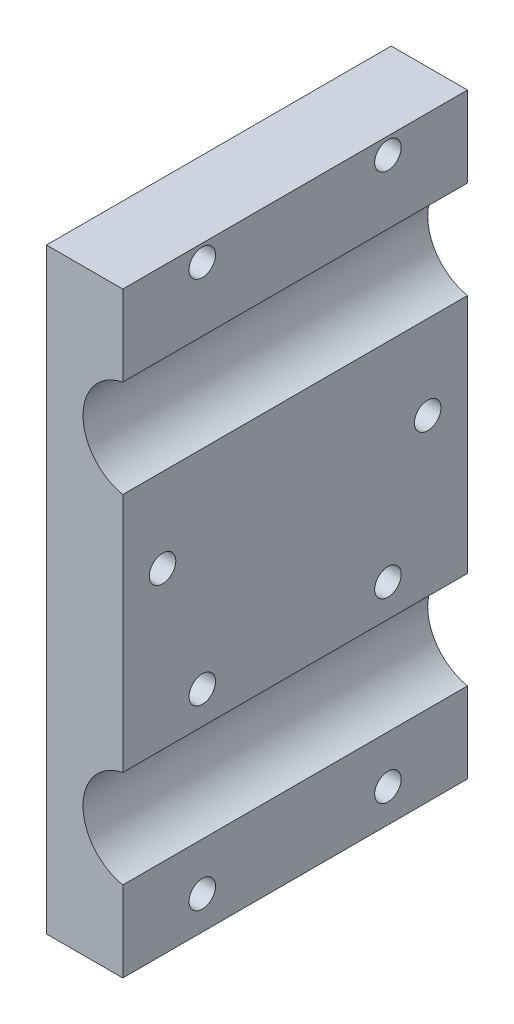
ISO-10303-21;
HEADER;
FILE_DESCRIPTION(('STEP AP214'),'2;1');
FILE_NAME('part.step','',(''),(''),'','','');
FILE_SCHEMA(('AUTOMOTIVE_DESIGN { 1 0 10303 214 1 1 1 1 }'));
ENDSEC;
DATA;
#1=APPLICATION_CONTEXT('core data for automotive mechanical design processes');
#2=APPLICATION_PROTOCOL_DEFINITION('international standard','automotive_design',2000,#1);
#3=PRODUCT_CONTEXT('',#1,'mechanical');
#4=PRODUCT('Part','Part','',(#3));
#5=PRODUCT_RELATED_PRODUCT_CATEGORY('part','',(#4));
#6=PRODUCT_DEFINITION_FORMATION('','',#4);
#7=PRODUCT_DEFINITION_CONTEXT('part definition',#1,'design');
#8=PRODUCT_DEFINITION('design','',#6,#7);
#9=PRODUCT_DEFINITION_SHAPE('','',#8);
#10=(LENGTH_UNIT() NAMED_UNIT(*) SI_UNIT(.MILLI.,.METRE.));
#11=(NAMED_UNIT(*) PLANE_ANGLE_UNIT() SI_UNIT($,.RADIAN.));
#12=(NAMED_UNIT(*) SI_UNIT($,.STERADIAN.) SOLID_ANGLE_UNIT());
#13=UNCERTAINTY_MEASURE_WITH_UNIT(LENGTH_MEASURE(1.E-05),#10,'distance_accuracy_value','');
#14=(GEOMETRIC_REPRESENTATION_CONTEXT(3) GLOBAL_UNCERTAINTY_ASSIGNED_CONTEXT((#13)) GLOBAL_UNIT_ASSIGNED_CONTEXT((#10,
#11,#12)) REPRESENTATION_CONTEXT('',''));
#15=CARTESIAN_POINT('',(0.,0.,0.));
#16=DIRECTION('',(0.,0.,1.));
#17=DIRECTION('',(1.,0.,0.));
#18=AXIS2_PLACEMENT_3D('',#15,#16,#17);
#19=CARTESIAN_POINT('',(-11.5000000000001,0.,52.));
#20=DIRECTION('',(1.,0.,0.));
#21=DIRECTION('',(0.,0.,-1.));
#22=AXIS2_PLACEMENT_3D('',#19,#20,#21);
#23=PLANE('',#22);
#24=CARTESIAN_POINT('',(-11.5000000000005,-39.5,6.));
#25=DIRECTION('',(1.,0.,0.));
#26=DIRECTION('',(0.,1.,0.));
#27=AXIS2_PLACEMENT_3D('',#24,#25,#26);
#28=CIRCLE('',#27,2.);
#29=CARTESIAN_POINT('',(-11.5000000000005,-37.5,6.));
#30=VERTEX_POINT('',#29);
#31=EDGE_CURVE('E210',#30,#30,#28,.T.);
#32=ORIENTED_EDGE('',*,*,#31,.T.);
#33=EDGE_LOOP('',(#32));
#34=FACE_BOUND('',#33,.T.);
#35=CARTESIAN_POINT('',(-11.5000000000005,-39.5,46.));
#36=DIRECTION('',(1.,0.,0.));
#37=DIRECTION('',(0.,1.,0.));
#38=AXIS2_PLACEMENT_3D('',#35,#36,#37);
#39=CIRCLE('',#38,2.);
#40=CARTESIAN_POINT('',(-11.5000000000005,-37.5,46.));
#41=VERTEX_POINT('',#40);
#42=EDGE_CURVE('E221',#41,#41,#39,.T.);
#43=ORIENTED_EDGE('',*,*,#42,.T.);
#44=EDGE_LOOP('',(#43));
#45=FACE_BOUND('',#44,.T.);
#46=CARTESIAN_POINT('',(-11.5000000000005,-58.2499999999999,12.));
#47=DIRECTION('',(1.,0.,0.));
#48=DIRECTION('',(0.,1.,0.));
#49=AXIS2_PLACEMENT_3D('',#46,#47,#48);
#50=CIRCLE('',#49,2.);
#51=CARTESIAN_POINT('',(-11.5000000000005,-56.2499999999999,12.));
#52=VERTEX_POINT('',#51);
#53=EDGE_CURVE('E187',#52,#52,#50,.T.);
#54=ORIENTED_EDGE('',*,*,#53,.T.);
#55=EDGE_LOOP('',(#54));
#56=FACE_BOUND('',#55,.T.);
#57=CARTESIAN_POINT('',(-11.5000000000005,-58.2499999999999,40.));
#58=DIRECTION('',(1.,0.,0.));
#59=DIRECTION('',(0.,1.,0.));
#60=AXIS2_PLACEMENT_3D('',#57,#58,#59);
#61=CIRCLE('',#60,2.);
#62=CARTESIAN_POINT('',(-11.5000000000005,-56.2499999999999,40.));
#63=VERTEX_POINT('',#62);
#64=EDGE_CURVE('E209',#63,#63,#61,.T.);
#65=ORIENTED_EDGE('',*,*,#64,.T.);
#66=EDGE_LOOP('',(#65));
#67=FACE_BOUND('',#66,.T.);
#68=CARTESIAN_POINT('',(-11.5000000000005,-85.,40.));
#69=DIRECTION('',(1.,0.,0.));
#70=DIRECTION('',(0.,1.,0.));
#71=AXIS2_PLACEMENT_3D('',#68,#69,#70);
#72=CIRCLE('',#71,2.);
#73=CARTESIAN_POINT('',(-11.5000000000005,-83.,40.));
#74=VERTEX_POINT('',#73);
#75=EDGE_CURVE('E186',#74,#74,#72,.T.);
#76=ORIENTED_EDGE('',*,*,#75,.T.);
#77=EDGE_LOOP('',(#76));
#78=FACE_BOUND('',#77,.T.);
#79=CARTESIAN_POINT('',(-11.5000000000005,-2.5,11.9999999999999));
#80=DIRECTION('',(1.,0.,0.));
#81=DIRECTION('',(0.,-1.,0.));
#82=AXIS2_PLACEMENT_3D('',#79,#80,#81);
#83=CIRCLE('',#82,2.);
#84=CARTESIAN_POINT('',(-11.5000000000005,-0.5,11.9999999999999));
#85=VERTEX_POINT('',#84);
#86=EDGE_CURVE('E195',#85,#85,#83,.T.);
#87=ORIENTED_EDGE('',*,*,#86,.T.);
#88=EDGE_LOOP('',(#87));
#89=FACE_BOUND('',#88,.T.);
#90=CARTESIAN_POINT('',(-11.5000000000001,-84.9999999999999,11.9999999999999));
#91=DIRECTION('',(1.,0.,0.));
#92=DIRECTION('',(0.,-1.,0.));
#93=AXIS2_PLACEMENT_3D('',#90,#91,#92);
#94=CIRCLE('',#93,2.);
#95=CARTESIAN_POINT('',(-11.5000000000001,-82.9999999999999,11.9999999999999));
#96=VERTEX_POINT('',#95);
#97=EDGE_CURVE('E177',#96,#96,#94,.T.);
#98=ORIENTED_EDGE('',*,*,#97,.T.);
#99=EDGE_LOOP('',(#98));
#100=FACE_BOUND('',#99,.T.);
#101=CARTESIAN_POINT('',(-11.5000000000001,-2.5,40.));
#102=DIRECTION('',(1.,0.,0.));
#103=DIRECTION('',(0.,1.,0.));
#104=AXIS2_PLACEMENT_3D('',#101,#102,#103);
#105=CIRCLE('',#104,2.);
#106=CARTESIAN_POINT('',(-11.5000000000001,-0.499999999999999,40.));
#107=VERTEX_POINT('',#106);
#108=EDGE_CURVE('E176',#107,#107,#105,.T.);
#109=ORIENTED_EDGE('',*,*,#108,.T.);
#110=EDGE_LOOP('',(#109));
#111=FACE_BOUND('',#110,.T.);
#112=DIRECTION('',(0.,-1.,0.));
#113=VECTOR('',#112,1.);
#114=CARTESIAN_POINT('',(-11.5,0.,0.));
#115=LINE('',#114,#113);
#116=CARTESIAN_POINT('',(-11.5,0.,0.));
#117=VERTEX_POINT('',#116);
#118=CARTESIAN_POINT('',(-11.5,-90.,0.));
#119=VERTEX_POINT('',#118);
#120=EDGE_CURVE('E181',#117,#119,#115,.T.);
#121=ORIENTED_EDGE('',*,*,#120,.T.);
#122=DIRECTION('',(0.,0.,-1.));
#123=VECTOR('',#122,1.);
#124=CARTESIAN_POINT('',(-11.5000000000001,-90.,52.));
#125=LINE('',#124,#123);
#126=CARTESIAN_POINT('',(-11.5000000000001,-90.,52.));
#127=VERTEX_POINT('',#126);
#128=EDGE_CURVE('E13',#127,#119,#125,.T.);
#129=ORIENTED_EDGE('',*,*,#128,.F.);
#130=DIRECTION('',(0.,-1.,0.));
#131=VECTOR('',#130,1.);
#132=CARTESIAN_POINT('',(-11.5000000000001,0.,52.));
#133=LINE('',#132,#131);
#134=CARTESIAN_POINT('',(-11.5000000000001,0.,52.));
#135=VERTEX_POINT('',#134);
#136=EDGE_CURVE('E169',#135,#127,#133,.T.);
#137=ORIENTED_EDGE('',*,*,#136,.F.);
#138=DIRECTION('',(0.,0.,-1.));
#139=VECTOR('',#138,1.);
#140=CARTESIAN_POINT('',(-11.5000000000001,0.,52.));
#141=LINE('',#140,#139);
#142=EDGE_CURVE('E151',#135,#117,#141,.T.);
#143=ORIENTED_EDGE('',*,*,#142,.T.);
#144=EDGE_LOOP('',(#121,#129,#137,#143));
#145=FACE_BOUND('',#144,.T.);
#146=ADVANCED_FACE('F54',(#34,#45,#56,#67,#78,#89,#100,#111,#145),#23,.F.);
#147=CARTESIAN_POINT('',(0.,-90.,52.));
#148=DIRECTION('',(0.,1.,0.));
#149=DIRECTION('',(0.,0.,1.));
#150=AXIS2_PLACEMENT_3D('',#147,#148,#149);
#151=PLANE('',#150);
#152=DIRECTION('',(1.,0.,0.));
#153=VECTOR('',#152,1.);
#154=CARTESIAN_POINT('',(0.,-90.,0.));
#155=LINE('',#154,#153);
#156=CARTESIAN_POINT('',(0.,-90.,0.));
#157=VERTEX_POINT('',#156);
#158=EDGE_CURVE('E289',#119,#157,#155,.T.);
#159=ORIENTED_EDGE('',*,*,#158,.T.);
#160=DIRECTION('',(0.,0.,-1.));
#161=VECTOR('',#160,1.);
#162=CARTESIAN_POINT('',(0.,-90.,52.));
#163=LINE('',#162,#161);
#164=CARTESIAN_POINT('',(0.,-90.,52.));
#165=VERTEX_POINT('',#164);
#166=EDGE_CURVE('E63',#165,#157,#163,.T.);
#167=ORIENTED_EDGE('',*,*,#166,.F.);
#168=DIRECTION('',(1.,0.,0.));
#169=VECTOR('',#168,1.);
#170=CARTESIAN_POINT('',(0.,-90.,52.));
#171=LINE('',#170,#169);
#172=EDGE_CURVE('E110',#127,#165,#171,.T.);
#173=ORIENTED_EDGE('',*,*,#172,.F.);
#174=ORIENTED_EDGE('',*,*,#128,.T.);
#175=EDGE_LOOP('',(#159,#167,#173,#174));
#176=FACE_BOUND('',#175,.T.);
#177=ADVANCED_FACE('F290',(#176),#151,.F.);
#178=CARTESIAN_POINT('',(0.,0.,52.));
#179=DIRECTION('',(1.,0.,0.));
#180=DIRECTION('',(0.,1.,0.));
#181=AXIS2_PLACEMENT_3D('',#178,#179,#180);
#182=PLANE('',#181);
#183=CARTESIAN_POINT('',(-4.44089209850063E-13,-85.,40.));
#184=DIRECTION('',(1.,0.,0.));
#185=DIRECTION('',(0.,1.,0.));
#186=AXIS2_PLACEMENT_3D('',#183,#184,#185);
#187=CIRCLE('',#186,2.);
#188=CARTESIAN_POINT('',(-4.45823933326039E-13,-83.,40.));
#189=VERTEX_POINT('',#188);
#190=EDGE_CURVE('E182',#189,#189,#187,.T.);
#191=ORIENTED_EDGE('',*,*,#190,.F.);
#192=EDGE_LOOP('',(#191));
#193=FACE_BOUND('',#192,.T.);
#194=CARTESIAN_POINT('',(0.,-84.9999999999999,12.));
#195=DIRECTION('',(1.,0.,0.));
#196=DIRECTION('',(0.,-1.,0.));
#197=AXIS2_PLACEMENT_3D('',#194,#195,#196);
#198=CIRCLE('',#197,2.);
#199=CARTESIAN_POINT('',(0.,-82.9999999999999,11.9999999999999));
#200=VERTEX_POINT('',#199);
#201=EDGE_CURVE('E199',#200,#200,#198,.T.);
#202=ORIENTED_EDGE('',*,*,#201,.F.);
#203=EDGE_LOOP('',(#202));
#204=FACE_BOUND('',#203,.T.);
#205=DIRECTION('',(0.,-1.,0.));
#206=VECTOR('',#205,1.);
#207=CARTESIAN_POINT('',(0.,0.,0.));
#208=LINE('',#207,#206);
#209=CARTESIAN_POINT('',(-5.55111512312578E-13,-77.8484692283495,0.));
#210=VERTEX_POINT('',#209);
#211=EDGE_CURVE('E287',#210,#157,#208,.T.);
#212=ORIENTED_EDGE('',*,*,#211,.F.);
#213=DIRECTION('',(0.,0.,-1.));
#214=VECTOR('',#213,1.);
#215=CARTESIAN_POINT('',(0.,-77.8484692283495,51.9999999999999));
#216=LINE('',#215,#214);
#217=CARTESIAN_POINT('',(0.,-77.8484692283495,51.9999999999999));
#218=VERTEX_POINT('',#217);
#219=EDGE_CURVE('E278',#218,#210,#216,.T.);
#220=ORIENTED_EDGE('',*,*,#219,.F.);
#221=DIRECTION('',(0.,-1.,0.));
#222=VECTOR('',#221,1.);
#223=CARTESIAN_POINT('',(0.,0.,52.));
#224=LINE('',#223,#222);
#225=EDGE_CURVE('E160',#218,#165,#224,.T.);
#226=ORIENTED_EDGE('',*,*,#225,.T.);
#227=ORIENTED_EDGE('',*,*,#166,.T.);
#228=EDGE_LOOP('',(#212,#220,#226,#227));
#229=FACE_BOUND('',#228,.T.);
#230=ADVANCED_FACE('F285',(#193,#204,#229),#182,.T.);
#231=CARTESIAN_POINT('',(1.49999999999995,-70.5,52.));
#232=DIRECTION('',(0.,0.,-1.));
#233=DIRECTION('',(-1.,0.,0.));
#234=AXIS2_PLACEMENT_3D('',#231,#232,#233);
#235=CYLINDRICAL_SURFACE('',#234,7.50000000000002);
#236=CARTESIAN_POINT('',(1.49999999999995,-70.4999999999999,0.));
#237=DIRECTION('',(0.,0.,1.));
#238=DIRECTION('',(1.,0.,0.));
#239=AXIS2_PLACEMENT_3D('',#236,#237,#238);
#240=CIRCLE('',#239,7.50000000000002);
#241=CARTESIAN_POINT('',(0.,-63.1515307716504,0.));
#242=VERTEX_POINT('',#241);
#243=EDGE_CURVE('E257',#242,#210,#240,.T.);
#244=ORIENTED_EDGE('',*,*,#243,.F.);
#245=DIRECTION('',(0.,0.,-1.));
#246=VECTOR('',#245,1.);
#247=CARTESIAN_POINT('',(-5.55111512312578E-13,-63.1515307716504,52.));
#248=LINE('',#247,#246);
#249=CARTESIAN_POINT('',(-5.55111512312578E-13,-63.1515307716504,52.));
#250=VERTEX_POINT('',#249);
#251=EDGE_CURVE('E252',#250,#242,#248,.T.);
#252=ORIENTED_EDGE('',*,*,#251,.F.);
#253=CARTESIAN_POINT('',(1.49999999999995,-70.5,52.));
#254=DIRECTION('',(0.,0.,1.));
#255=DIRECTION('',(1.,0.,0.));
#256=AXIS2_PLACEMENT_3D('',#253,#254,#255);
#257=CIRCLE('',#256,7.50000000000002);
#258=EDGE_CURVE('E155',#250,#218,#257,.T.);
#259=ORIENTED_EDGE('',*,*,#258,.T.);
#260=ORIENTED_EDGE('',*,*,#219,.T.);
#261=EDGE_LOOP('',(#244,#252,#259,#260));
#262=FACE_BOUND('',#261,.T.);
#263=ADVANCED_FACE('F242',(#262),#235,.F.);
#264=CARTESIAN_POINT('',(0.,0.,52.));
#265=DIRECTION('',(1.,0.,0.));
#266=DIRECTION('',(0.,1.,0.));
#267=AXIS2_PLACEMENT_3D('',#264,#265,#266);
#268=PLANE('',#267);
#269=CARTESIAN_POINT('',(0.,-39.5,6.));
#270=DIRECTION('',(1.,0.,0.));
#271=DIRECTION('',(0.,1.,0.));
#272=AXIS2_PLACEMENT_3D('',#269,#270,#271);
#273=CIRCLE('',#272,2.);
#274=CARTESIAN_POINT('',(0.,-37.5,6.));
#275=VERTEX_POINT('',#274);
#276=EDGE_CURVE('E224',#275,#275,#273,.T.);
#277=ORIENTED_EDGE('',*,*,#276,.F.);
#278=EDGE_LOOP('',(#277));
#279=FACE_BOUND('',#278,.T.);
#280=CARTESIAN_POINT('',(0.,-39.5,46.));
#281=DIRECTION('',(1.,0.,0.));
#282=DIRECTION('',(0.,1.,0.));
#283=AXIS2_PLACEMENT_3D('',#280,#281,#282);
#284=CIRCLE('',#283,2.);
#285=CARTESIAN_POINT('',(0.,-37.5,46.));
#286=VERTEX_POINT('',#285);
#287=EDGE_CURVE('E218',#286,#286,#284,.T.);
#288=ORIENTED_EDGE('',*,*,#287,.F.);
#289=EDGE_LOOP('',(#288));
#290=FACE_BOUND('',#289,.T.);
#291=CARTESIAN_POINT('',(0.,-58.2499999999999,12.));
#292=DIRECTION('',(1.,0.,0.));
#293=DIRECTION('',(0.,1.,0.));
#294=AXIS2_PLACEMENT_3D('',#291,#292,#293);
#295=CIRCLE('',#294,2.);
#296=CARTESIAN_POINT('',(0.,-56.2499999999999,12.));
#297=VERTEX_POINT('',#296);
#298=EDGE_CURVE('E213',#297,#297,#295,.T.);
#299=ORIENTED_EDGE('',*,*,#298,.F.);
#300=EDGE_LOOP('',(#299));
#301=FACE_BOUND('',#300,.T.);
#302=CARTESIAN_POINT('',(0.,-58.2499999999999,40.));
#303=DIRECTION('',(1.,0.,0.));
#304=DIRECTION('',(0.,1.,0.));
#305=AXIS2_PLACEMENT_3D('',#302,#303,#304);
#306=CIRCLE('',#305,2.);
#307=CARTESIAN_POINT('',(0.,-56.2499999999999,40.));
#308=VERTEX_POINT('',#307);
#309=EDGE_CURVE('E206',#308,#308,#306,.T.);
#310=ORIENTED_EDGE('',*,*,#309,.F.);
#311=EDGE_LOOP('',(#310));
#312=FACE_BOUND('',#311,.T.);
#313=DIRECTION('',(0.,-1.,0.));
#314=VECTOR('',#313,1.);
#315=CARTESIAN_POINT('',(0.,0.,0.));
#316=LINE('',#315,#314);
#317=CARTESIAN_POINT('',(-4.44089209850063E-13,-26.8484692283495,0.));
#318=VERTEX_POINT('',#317);
#319=EDGE_CURVE('E251',#318,#242,#316,.T.);
#320=ORIENTED_EDGE('',*,*,#319,.F.);
#321=DIRECTION('',(0.,0.,-1.));
#322=VECTOR('',#321,1.);
#323=CARTESIAN_POINT('',(-5.55111512312578E-13,-26.8484692283495,52.));
#324=LINE('',#323,#322);
#325=CARTESIAN_POINT('',(-5.55111512312578E-13,-26.8484692283495,52.));
#326=VERTEX_POINT('',#325);
#327=EDGE_CURVE('E136',#326,#318,#324,.T.);
#328=ORIENTED_EDGE('',*,*,#327,.F.);
#329=DIRECTION('',(0.,-1.,0.));
#330=VECTOR('',#329,1.);
#331=CARTESIAN_POINT('',(0.,0.,52.));
#332=LINE('',#331,#330);
#333=EDGE_CURVE('E143',#326,#250,#332,.T.);
#334=ORIENTED_EDGE('',*,*,#333,.T.);
#335=ORIENTED_EDGE('',*,*,#251,.T.);
#336=EDGE_LOOP('',(#320,#328,#334,#335));
#337=FACE_BOUND('',#336,.T.);
#338=ADVANCED_FACE('F239',(#279,#290,#301,#312,#337),#268,.T.);
#339=CARTESIAN_POINT('',(1.49999999999995,-19.5,52.));
#340=DIRECTION('',(0.,0.,-1.));
#341=DIRECTION('',(-1.,0.,0.));
#342=AXIS2_PLACEMENT_3D('',#339,#340,#341);
#343=CYLINDRICAL_SURFACE('',#342,7.5);
#344=CARTESIAN_POINT('',(1.4999999999995,-19.4999999999999,0.));
#345=DIRECTION('',(0.,0.,1.));
#346=DIRECTION('',(1.,0.,0.));
#347=AXIS2_PLACEMENT_3D('',#344,#345,#346);
#348=CIRCLE('',#347,7.5);
#349=CARTESIAN_POINT('',(0.,-12.1515307716505,0.));
#350=VERTEX_POINT('',#349);
#351=EDGE_CURVE('E130',#350,#318,#348,.T.);
#352=ORIENTED_EDGE('',*,*,#351,.F.);
#353=DIRECTION('',(0.,0.,-1.));
#354=VECTOR('',#353,1.);
#355=CARTESIAN_POINT('',(-5.55111512312578E-13,-12.1515307716505,52.));
#356=LINE('',#355,#354);
#357=CARTESIAN_POINT('',(-5.55111512312578E-13,-12.1515307716505,52.));
#358=VERTEX_POINT('',#357);
#359=EDGE_CURVE('E125',#358,#350,#356,.T.);
#360=ORIENTED_EDGE('',*,*,#359,.F.);
#361=CARTESIAN_POINT('',(1.49999999999995,-19.5,52.));
#362=DIRECTION('',(0.,0.,1.));
#363=DIRECTION('',(1.,0.,0.));
#364=AXIS2_PLACEMENT_3D('',#361,#362,#363);
#365=CIRCLE('',#364,7.5);
#366=EDGE_CURVE('E128',#358,#326,#365,.T.);
#367=ORIENTED_EDGE('',*,*,#366,.T.);
#368=ORIENTED_EDGE('',*,*,#327,.T.);
#369=EDGE_LOOP('',(#352,#360,#367,#368));
#370=FACE_BOUND('',#369,.T.);
#371=ADVANCED_FACE('F127',(#370),#343,.F.);
#372=CARTESIAN_POINT('',(-5.55111512312578E-13,-2.5,12.));
#373=DIRECTION('',(1.,0.,0.));
#374=DIRECTION('',(0.,-1.,0.));
#375=AXIS2_PLACEMENT_3D('',#372,#373,#374);
#376=CIRCLE('',#375,2.);
#377=CARTESIAN_POINT('',(-5.56846235788555E-13,-0.499999999999998,11.9999999999999));
#378=VERTEX_POINT('',#377);
#379=EDGE_CURVE('E191',#378,#378,#376,.T.);
#380=ORIENTED_EDGE('',*,*,#379,.F.);
#381=EDGE_LOOP('',(#380));
#382=FACE_BOUND('',#381,.T.);
#383=CARTESIAN_POINT('',(0.,-2.5,40.));
#384=DIRECTION('',(1.,0.,0.));
#385=DIRECTION('',(0.,1.,0.));
#386=AXIS2_PLACEMENT_3D('',#383,#384,#385);
#387=CIRCLE('',#386,2.);
#388=CARTESIAN_POINT('',(0.,-0.499999999999998,40.));
#389=VERTEX_POINT('',#388);
#390=EDGE_CURVE('E172',#389,#389,#387,.T.);
#391=ORIENTED_EDGE('',*,*,#390,.F.);
#392=EDGE_LOOP('',(#391));
#393=FACE_BOUND('',#392,.T.);
#394=CARTESIAN_POINT('',(0.,0.,0.));
#395=VERTEX_POINT('',#394);
#396=EDGE_CURVE('E259',#395,#350,#316,.T.);
#397=ORIENTED_EDGE('',*,*,#396,.F.);
#398=DIRECTION('',(0.,0.,-1.));
#399=VECTOR('',#398,1.);
#400=CARTESIAN_POINT('',(0.,0.,52.));
#401=LINE('',#400,#399);
#402=CARTESIAN_POINT('',(0.,0.,52.));
#403=VERTEX_POINT('',#402);
#404=EDGE_CURVE('E99',#403,#395,#401,.T.);
#405=ORIENTED_EDGE('',*,*,#404,.F.);
#406=EDGE_CURVE('E140',#403,#358,#332,.T.);
#407=ORIENTED_EDGE('',*,*,#406,.T.);
#408=ORIENTED_EDGE('',*,*,#359,.T.);
#409=EDGE_LOOP('',(#397,#405,#407,#408));
#410=FACE_BOUND('',#409,.T.);
#411=ADVANCED_FACE('F146',(#382,#393,#410),#268,.T.);
#412=CARTESIAN_POINT('',(0.,0.,52.));
#413=DIRECTION('',(0.,-1.,0.));
#414=DIRECTION('',(1.,0.,0.));
#415=AXIS2_PLACEMENT_3D('',#412,#413,#414);
#416=PLANE('',#415);
#417=DIRECTION('',(-1.,0.,0.));
#418=VECTOR('',#417,1.);
#419=CARTESIAN_POINT('',(0.,0.,0.));
#420=LINE('',#419,#418);
#421=EDGE_CURVE('E102',#395,#117,#420,.T.);
#422=ORIENTED_EDGE('',*,*,#421,.T.);
#423=ORIENTED_EDGE('',*,*,#142,.F.);
#424=DIRECTION('',(-1.,0.,0.));
#425=VECTOR('',#424,1.);
#426=CARTESIAN_POINT('',(0.,0.,52.));
#427=LINE('',#426,#425);
#428=EDGE_CURVE('E71',#403,#135,#427,.T.);
#429=ORIENTED_EDGE('',*,*,#428,.F.);
#430=ORIENTED_EDGE('',*,*,#404,.T.);
#431=EDGE_LOOP('',(#422,#423,#429,#430));
#432=FACE_BOUND('',#431,.T.);
#433=ADVANCED_FACE('F304',(#432),#416,.F.);
#434=CARTESIAN_POINT('',(0.,0.,52.));
#435=DIRECTION('',(0.,0.,1.));
#436=DIRECTION('',(1.,0.,0.));
#437=AXIS2_PLACEMENT_3D('',#434,#435,#436);
#438=PLANE('',#437);
#439=ORIENTED_EDGE('',*,*,#136,.T.);
#440=ORIENTED_EDGE('',*,*,#172,.T.);
#441=ORIENTED_EDGE('',*,*,#225,.F.);
#442=ORIENTED_EDGE('',*,*,#258,.F.);
#443=ORIENTED_EDGE('',*,*,#333,.F.);
#444=ORIENTED_EDGE('',*,*,#366,.F.);
#445=ORIENTED_EDGE('',*,*,#406,.F.);
#446=ORIENTED_EDGE('',*,*,#428,.T.);
#447=EDGE_LOOP('',(#439,#440,#441,#442,#443,#444,#445,#446));
#448=FACE_BOUND('',#447,.T.);
#449=ADVANCED_FACE('F139',(#448),#438,.T.);
#450=CARTESIAN_POINT('',(0.,0.,0.));
#451=DIRECTION('',(0.,0.,1.));
#452=DIRECTION('',(1.,0.,0.));
#453=AXIS2_PLACEMENT_3D('',#450,#451,#452);
#454=PLANE('',#453);
#455=ORIENTED_EDGE('',*,*,#120,.F.);
#456=ORIENTED_EDGE('',*,*,#421,.F.);
#457=ORIENTED_EDGE('',*,*,#396,.T.);
#458=ORIENTED_EDGE('',*,*,#351,.T.);
#459=ORIENTED_EDGE('',*,*,#319,.T.);
#460=ORIENTED_EDGE('',*,*,#243,.T.);
#461=ORIENTED_EDGE('',*,*,#211,.T.);
#462=ORIENTED_EDGE('',*,*,#158,.F.);
#463=EDGE_LOOP('',(#455,#456,#457,#458,#459,#460,#461,#462));
#464=FACE_BOUND('',#463,.T.);
#465=ADVANCED_FACE('F261',(#464),#454,.F.);
#466=CARTESIAN_POINT('',(-11.5000000000001,-2.5,40.));
#467=DIRECTION('',(1.,0.,0.));
#468=DIRECTION('',(0.,1.,0.));
#469=AXIS2_PLACEMENT_3D('',#466,#467,#468);
#470=CYLINDRICAL_SURFACE('',#469,2.);
#471=CARTESIAN_POINT('',(-11.5000000000001,-0.499999999999999,40.));
#472=CARTESIAN_POINT('',(-11.3802083333334,-0.499999999999999,40.));
#473=CARTESIAN_POINT('',(-11.2604166666667,-0.499999999999999,40.));
#474=CARTESIAN_POINT('',(-11.0208333333334,-0.499999999999999,40.));
#475=CARTESIAN_POINT('',(-10.9010416666667,-0.499999999999999,40.));
#476=CARTESIAN_POINT('',(-10.6614583333334,-0.499999999999999,40.));
#477=CARTESIAN_POINT('',(-10.5416666666667,-0.499999999999999,40.));
#478=CARTESIAN_POINT('',(-10.3020833333334,-0.499999999999999,40.));
#479=CARTESIAN_POINT('',(-10.1822916666667,-0.499999999999999,40.));
#480=CARTESIAN_POINT('',(-9.94270833333339,-0.499999999999999,40.));
#481=CARTESIAN_POINT('',(-9.82291666666672,-0.499999999999999,40.));
#482=CARTESIAN_POINT('',(-9.58333333333339,-0.499999999999999,40.));
#483=CARTESIAN_POINT('',(-9.46354166666672,-0.499999999999999,40.));
#484=CARTESIAN_POINT('',(-9.22395833333339,-0.499999999999999,40.));
#485=CARTESIAN_POINT('',(-9.10416666666672,-0.499999999999999,40.));
#486=CARTESIAN_POINT('',(-8.86458333333338,-0.499999999999999,40.));
#487=CARTESIAN_POINT('',(-8.74479166666672,-0.499999999999999,40.));
#488=CARTESIAN_POINT('',(-8.50520833333338,-0.499999999999999,40.));
#489=CARTESIAN_POINT('',(-8.38541666666671,-0.499999999999999,40.));
#490=CARTESIAN_POINT('',(-8.14583333333338,-0.499999999999999,40.));
#491=CARTESIAN_POINT('',(-8.02604166666671,-0.499999999999999,40.));
#492=CARTESIAN_POINT('',(-7.78645833333338,-0.499999999999999,40.));
#493=CARTESIAN_POINT('',(-7.66666666666671,-0.499999999999999,40.));
#494=CARTESIAN_POINT('',(-7.42708333333338,-0.499999999999999,40.));
#495=CARTESIAN_POINT('',(-7.30729166666671,-0.499999999999999,40.));
#496=CARTESIAN_POINT('',(-7.06770833333337,-0.499999999999999,40.));
#497=CARTESIAN_POINT('',(-6.94791666666671,-0.499999999999999,40.));
#498=CARTESIAN_POINT('',(-6.70833333333337,-0.499999999999999,40.));
#499=CARTESIAN_POINT('',(-6.58854166666671,-0.499999999999999,40.));
#500=CARTESIAN_POINT('',(-6.34895833333337,-0.499999999999999,40.));
#501=CARTESIAN_POINT('',(-6.2291666666667,-0.499999999999998,40.));
#502=CARTESIAN_POINT('',(-5.98958333333337,-0.499999999999998,40.));
#503=CARTESIAN_POINT('',(-5.8697916666667,-0.499999999999998,40.));
#504=CARTESIAN_POINT('',(-5.63020833333337,-0.499999999999998,40.));
#505=CARTESIAN_POINT('',(-5.5104166666667,-0.499999999999998,40.));
#506=CARTESIAN_POINT('',(-5.27083333333336,-0.499999999999998,40.));
#507=CARTESIAN_POINT('',(-5.1510416666667,-0.499999999999998,40.));
#508=CARTESIAN_POINT('',(-4.91145833333336,-0.499999999999998,40.));
#509=CARTESIAN_POINT('',(-4.79166666666669,-0.499999999999998,40.));
#510=CARTESIAN_POINT('',(-4.55208333333336,-0.499999999999998,40.));
#511=CARTESIAN_POINT('',(-4.43229166666669,-0.499999999999998,40.));
#512=CARTESIAN_POINT('',(-4.19270833333336,-0.499999999999998,40.));
#513=CARTESIAN_POINT('',(-4.07291666666669,-0.499999999999998,40.));
#514=CARTESIAN_POINT('',(-3.83333333333336,-0.499999999999998,40.));
#515=CARTESIAN_POINT('',(-3.71354166666669,-0.499999999999998,40.));
#516=CARTESIAN_POINT('',(-3.47395833333335,-0.499999999999998,40.));
#517=CARTESIAN_POINT('',(-3.35416666666669,-0.499999999999998,40.));
#518=CARTESIAN_POINT('',(-3.11458333333335,-0.499999999999998,40.));
#519=CARTESIAN_POINT('',(-2.99479166666669,-0.499999999999998,40.));
#520=CARTESIAN_POINT('',(-2.75520833333335,-0.499999999999998,40.));
#521=CARTESIAN_POINT('',(-2.63541666666668,-0.499999999999998,40.));
#522=CARTESIAN_POINT('',(-2.39583333333335,-0.499999999999998,40.));
#523=CARTESIAN_POINT('',(-2.27604166666668,-0.499999999999998,40.));
#524=CARTESIAN_POINT('',(-2.03645833333335,-0.499999999999998,40.));
#525=CARTESIAN_POINT('',(-1.91666666666668,-0.499999999999998,40.));
#526=CARTESIAN_POINT('',(-1.67708333333334,-0.499999999999998,40.));
#527=CARTESIAN_POINT('',(-1.55729166666668,-0.499999999999998,40.));
#528=CARTESIAN_POINT('',(-1.31770833333334,-0.499999999999998,40.));
#529=CARTESIAN_POINT('',(-1.19791666666668,-0.499999999999998,40.));
#530=CARTESIAN_POINT('',(-0.958333333333341,-0.499999999999998,40.));
#531=CARTESIAN_POINT('',(-0.838541666666673,-0.499999999999998,40.));
#532=CARTESIAN_POINT('',(-0.598958333333338,-0.499999999999998,40.));
#533=CARTESIAN_POINT('',(-0.479166666666671,-0.499999999999998,40.));
#534=CARTESIAN_POINT('',(-0.239583333333336,-0.499999999999998,40.));
#535=CARTESIAN_POINT('',(-0.119791666666669,-0.499999999999998,40.));
#536=CARTESIAN_POINT('',(0.,-0.499999999999998,40.));
#537=B_SPLINE_CURVE_WITH_KNOTS('',3,(#471,#472,#473,#474,#475,#476,#477,#478,#479,#480,#481,
#482,#483,#484,#485,#486,#487,#488,#489,#490,#491,#492,#493,#494,#495,#496,#497,#498,#499,#500,
#501,#502,#503,#504,#505,#506,#507,#508,#509,#510,#511,#512,#513,#514,#515,#516,#517,#518,#519,
#520,#521,#522,#523,#524,#525,#526,#527,#528,#529,#530,#531,#532,#533,#534,#535,#536),
.UNSPECIFIED.,.F.,.F.,(4,2,2,2,2,2,2,2,2,2,2,2,2,2,2,2,2,2,2,2,2,2,2,2,2,2,2,2,2,2,2,2,4),(0.,
0.359375000000004,0.718750000000006,1.07812500000001,1.43750000000001,1.79687500000001,
2.15625000000001,2.51562500000002,2.87500000000002,3.23437500000002,3.59375000000002,
3.95312500000002,4.31250000000003,4.67187500000003,5.03125000000003,5.39062500000003,
5.75000000000003,6.10937500000004,6.46875000000004,6.82812500000004,7.18750000000004,
7.54687500000004,7.90625000000005,8.26562500000005,8.62500000000005,8.98437500000005,
9.34375000000005,9.70312500000006,10.0625000000001,10.4218750000001,10.7812500000001,
11.1406250000001,11.5000000000001),.UNSPECIFIED.);
#538=EDGE_CURVE('BSEAM356',#107,#389,#537,.T.);
#539=ORIENTED_EDGE('',*,*,#108,.F.);
#540=ORIENTED_EDGE('',*,*,#390,.T.);
#541=ORIENTED_EDGE('',*,*,#538,.T.);
#542=ORIENTED_EDGE('',*,*,#538,.F.);
#543=EDGE_LOOP('',(#539,#541,#540,#542));
#544=FACE_BOUND('',#543,.T.);
#545=ADVANCED_FACE('F356',(#544),#470,.F.);
#546=CARTESIAN_POINT('',(-11.5000000000005,-2.5,11.9999999999999));
#547=DIRECTION('',(1.,0.,0.));
#548=DIRECTION('',(0.,1.,0.));
#549=AXIS2_PLACEMENT_3D('',#546,#547,#548);
#550=CYLINDRICAL_SURFACE('',#549,2.);
#551=CARTESIAN_POINT('',(-11.5000000000005,-0.5,11.9999999999999));
#552=CARTESIAN_POINT('',(-11.3802083333338,-0.5,11.9999999999999));
#553=CARTESIAN_POINT('',(-11.2604166666672,-0.5,11.9999999999999));
#554=CARTESIAN_POINT('',(-11.0208333333338,-0.5,11.9999999999999));
#555=CARTESIAN_POINT('',(-10.9010416666672,-0.499999999999999,11.9999999999999));
#556=CARTESIAN_POINT('',(-10.6614583333338,-0.499999999999999,11.9999999999999));
#557=CARTESIAN_POINT('',(-10.5416666666672,-0.499999999999999,11.9999999999999));
#558=CARTESIAN_POINT('',(-10.3020833333338,-0.499999999999999,11.9999999999999));
#559=CARTESIAN_POINT('',(-10.1822916666672,-0.499999999999999,11.9999999999999));
#560=CARTESIAN_POINT('',(-9.94270833333385,-0.499999999999999,11.9999999999999));
#561=CARTESIAN_POINT('',(-9.82291666666718,-0.499999999999999,11.9999999999999));
#562=CARTESIAN_POINT('',(-9.58333333333385,-0.499999999999999,11.9999999999999));
#563=CARTESIAN_POINT('',(-9.46354166666718,-0.499999999999999,11.9999999999999));
#564=CARTESIAN_POINT('',(-9.22395833333385,-0.499999999999999,11.9999999999999));
#565=CARTESIAN_POINT('',(-9.10416666666718,-0.499999999999999,11.9999999999999));
#566=CARTESIAN_POINT('',(-8.86458333333385,-0.499999999999999,11.9999999999999));
#567=CARTESIAN_POINT('',(-8.74479166666719,-0.499999999999999,11.9999999999999));
#568=CARTESIAN_POINT('',(-8.50520833333386,-0.499999999999999,11.9999999999999));
#569=CARTESIAN_POINT('',(-8.38541666666719,-0.499999999999999,11.9999999999999));
#570=CARTESIAN_POINT('',(-8.14583333333386,-0.499999999999999,11.9999999999999));
#571=CARTESIAN_POINT('',(-8.02604166666719,-0.499999999999999,11.9999999999999));
#572=CARTESIAN_POINT('',(-7.78645833333386,-0.499999999999999,11.9999999999999));
#573=CARTESIAN_POINT('',(-7.66666666666719,-0.499999999999999,11.9999999999999));
#574=CARTESIAN_POINT('',(-7.42708333333386,-0.499999999999999,11.9999999999999));
#575=CARTESIAN_POINT('',(-7.30729166666719,-0.499999999999999,11.9999999999999));
#576=CARTESIAN_POINT('',(-7.06770833333386,-0.499999999999999,11.9999999999999));
#577=CARTESIAN_POINT('',(-6.9479166666672,-0.499999999999999,11.9999999999999));
#578=CARTESIAN_POINT('',(-6.70833333333386,-0.499999999999999,11.9999999999999));
#579=CARTESIAN_POINT('',(-6.5885416666672,-0.499999999999999,11.9999999999999));
#580=CARTESIAN_POINT('',(-6.34895833333386,-0.499999999999999,11.9999999999999));
#581=CARTESIAN_POINT('',(-6.2291666666672,-0.499999999999999,11.9999999999999));
#582=CARTESIAN_POINT('',(-5.98958333333387,-0.499999999999999,11.9999999999999));
#583=CARTESIAN_POINT('',(-5.8697916666672,-0.499999999999999,11.9999999999999));
#584=CARTESIAN_POINT('',(-5.63020833333387,-0.499999999999999,11.9999999999999));
#585=CARTESIAN_POINT('',(-5.5104166666672,-0.499999999999999,11.9999999999999));
#586=CARTESIAN_POINT('',(-5.27083333333387,-0.499999999999999,11.9999999999999));
#587=CARTESIAN_POINT('',(-5.1510416666672,-0.499999999999999,11.9999999999999));
#588=CARTESIAN_POINT('',(-4.91145833333387,-0.499999999999999,11.9999999999999));
#589=CARTESIAN_POINT('',(-4.7916666666672,-0.499999999999999,11.9999999999999));
#590=CARTESIAN_POINT('',(-4.55208333333387,-0.499999999999999,11.9999999999999));
#591=CARTESIAN_POINT('',(-4.43229166666721,-0.499999999999999,11.9999999999999));
#592=CARTESIAN_POINT('',(-4.19270833333387,-0.499999999999999,11.9999999999999));
#593=CARTESIAN_POINT('',(-4.07291666666721,-0.499999999999999,11.9999999999999));
#594=CARTESIAN_POINT('',(-3.83333333333387,-0.499999999999999,11.9999999999999));
#595=CARTESIAN_POINT('',(-3.71354166666721,-0.499999999999999,11.9999999999999));
#596=CARTESIAN_POINT('',(-3.47395833333388,-0.499999999999999,11.9999999999999));
#597=CARTESIAN_POINT('',(-3.35416666666721,-0.499999999999999,11.9999999999999));
#598=CARTESIAN_POINT('',(-3.11458333333388,-0.499999999999999,11.9999999999999));
#599=CARTESIAN_POINT('',(-2.99479166666721,-0.499999999999998,11.9999999999999));
#600=CARTESIAN_POINT('',(-2.75520833333388,-0.499999999999998,11.9999999999999));
#601=CARTESIAN_POINT('',(-2.63541666666721,-0.499999999999998,11.9999999999999));
#602=CARTESIAN_POINT('',(-2.39583333333388,-0.499999999999998,11.9999999999999));
#603=CARTESIAN_POINT('',(-2.27604166666721,-0.499999999999998,11.9999999999999));
#604=CARTESIAN_POINT('',(-2.03645833333388,-0.499999999999998,11.9999999999999));
#605=CARTESIAN_POINT('',(-1.91666666666722,-0.499999999999998,11.9999999999999));
#606=CARTESIAN_POINT('',(-1.67708333333388,-0.499999999999998,11.9999999999999));
#607=CARTESIAN_POINT('',(-1.55729166666722,-0.499999999999998,11.9999999999999));
#608=CARTESIAN_POINT('',(-1.31770833333388,-0.499999999999998,11.9999999999999));
#609=CARTESIAN_POINT('',(-1.19791666666722,-0.499999999999998,11.9999999999999));
#610=CARTESIAN_POINT('',(-0.958333333333886,-0.499999999999998,11.9999999999999));
#611=CARTESIAN_POINT('',(-0.83854166666722,-0.499999999999998,11.9999999999999));
#612=CARTESIAN_POINT('',(-0.598958333333888,-0.499999999999998,11.9999999999999));
#613=CARTESIAN_POINT('',(-0.479166666667222,-0.499999999999998,11.9999999999999));
#614=CARTESIAN_POINT('',(-0.239583333333889,-0.499999999999998,11.9999999999999));
#615=CARTESIAN_POINT('',(-0.119791666667223,-0.499999999999998,11.9999999999999));
#616=CARTESIAN_POINT('',(-5.56846235788555E-13,-0.499999999999998,11.9999999999999));
#617=B_SPLINE_CURVE_WITH_KNOTS('',3,(#551,#552,#553,#554,#555,#556,#557,#558,#559,#560,#561,
#562,#563,#564,#565,#566,#567,#568,#569,#570,#571,#572,#573,#574,#575,#576,#577,#578,#579,#580,
#581,#582,#583,#584,#585,#586,#587,#588,#589,#590,#591,#592,#593,#594,#595,#596,#597,#598,#599,
#600,#601,#602,#603,#604,#605,#606,#607,#608,#609,#610,#611,#612,#613,#614,#615,#616),
.UNSPECIFIED.,.F.,.F.,(4,2,2,2,2,2,2,2,2,2,2,2,2,2,2,2,2,2,2,2,2,2,2,2,2,2,2,2,2,2,2,2,4),(0.,
0.359375,0.718749999999999,1.078125,1.4375,1.79687499999999,2.15624999999999,2.51562499999999,
2.87499999999999,3.23437499999999,3.59374999999999,3.95312499999999,4.31249999999998,
4.67187499999998,5.03124999999998,5.39062499999998,5.74999999999998,6.10937499999998,
6.46874999999998,6.82812499999997,7.18749999999997,7.54687499999997,7.90624999999997,
8.26562499999997,8.62499999999997,8.98437499999996,9.34374999999996,9.70312499999996,10.0625,
10.421875,10.78125,11.140625,11.5),.UNSPECIFIED.);
#618=EDGE_CURVE('BSEAM364',#85,#378,#617,.T.);
#619=ORIENTED_EDGE('',*,*,#86,.F.);
#620=ORIENTED_EDGE('',*,*,#379,.T.);
#621=ORIENTED_EDGE('',*,*,#618,.T.);
#622=ORIENTED_EDGE('',*,*,#618,.F.);
#623=EDGE_LOOP('',(#619,#621,#620,#622));
#624=FACE_BOUND('',#623,.T.);
#625=ADVANCED_FACE('F364',(#624),#550,.F.);
#626=CARTESIAN_POINT('',(-11.5000000000001,-84.9999999999999,11.9999999999999));
#627=DIRECTION('',(1.,0.,0.));
#628=DIRECTION('',(0.,1.,0.));
#629=AXIS2_PLACEMENT_3D('',#626,#627,#628);
#630=CYLINDRICAL_SURFACE('',#629,2.);
#631=CARTESIAN_POINT('',(-11.5000000000001,-82.9999999999999,11.9999999999999));
#632=CARTESIAN_POINT('',(-11.3802083333334,-82.9999999999999,11.9999999999999));
#633=CARTESIAN_POINT('',(-11.2604166666667,-82.9999999999999,11.9999999999999));
#634=CARTESIAN_POINT('',(-11.0208333333334,-82.9999999999999,11.9999999999999));
#635=CARTESIAN_POINT('',(-10.9010416666667,-82.9999999999999,11.9999999999999));
#636=CARTESIAN_POINT('',(-10.6614583333334,-82.9999999999999,11.9999999999999));
#637=CARTESIAN_POINT('',(-10.5416666666667,-82.9999999999999,11.9999999999999));
#638=CARTESIAN_POINT('',(-10.3020833333334,-82.9999999999999,11.9999999999999));
#639=CARTESIAN_POINT('',(-10.1822916666667,-82.9999999999999,11.9999999999999));
#640=CARTESIAN_POINT('',(-9.94270833333339,-82.9999999999999,11.9999999999999));
#641=CARTESIAN_POINT('',(-9.82291666666672,-82.9999999999999,11.9999999999999));
#642=CARTESIAN_POINT('',(-9.58333333333339,-82.9999999999999,11.9999999999999));
#643=CARTESIAN_POINT('',(-9.46354166666672,-82.9999999999999,11.9999999999999));
#644=CARTESIAN_POINT('',(-9.22395833333339,-82.9999999999999,11.9999999999999));
#645=CARTESIAN_POINT('',(-9.10416666666672,-82.9999999999999,11.9999999999999));
#646=CARTESIAN_POINT('',(-8.86458333333338,-82.9999999999999,11.9999999999999));
#647=CARTESIAN_POINT('',(-8.74479166666672,-82.9999999999999,11.9999999999999));
#648=CARTESIAN_POINT('',(-8.50520833333338,-82.9999999999999,11.9999999999999));
#649=CARTESIAN_POINT('',(-8.38541666666671,-82.9999999999999,11.9999999999999));
#650=CARTESIAN_POINT('',(-8.14583333333338,-82.9999999999999,11.9999999999999));
#651=CARTESIAN_POINT('',(-8.02604166666671,-82.9999999999999,11.9999999999999));
#652=CARTESIAN_POINT('',(-7.78645833333338,-82.9999999999999,11.9999999999999));
#653=CARTESIAN_POINT('',(-7.66666666666671,-82.9999999999999,11.9999999999999));
#654=CARTESIAN_POINT('',(-7.42708333333338,-82.9999999999999,11.9999999999999));
#655=CARTESIAN_POINT('',(-7.30729166666671,-82.9999999999999,11.9999999999999));
#656=CARTESIAN_POINT('',(-7.06770833333337,-82.9999999999999,11.9999999999999));
#657=CARTESIAN_POINT('',(-6.94791666666671,-82.9999999999999,11.9999999999999));
#658=CARTESIAN_POINT('',(-6.70833333333337,-82.9999999999999,11.9999999999999));
#659=CARTESIAN_POINT('',(-6.58854166666671,-82.9999999999999,11.9999999999999));
#660=CARTESIAN_POINT('',(-6.34895833333337,-82.9999999999999,11.9999999999999));
#661=CARTESIAN_POINT('',(-6.2291666666667,-82.9999999999999,11.9999999999999));
#662=CARTESIAN_POINT('',(-5.98958333333337,-82.9999999999999,11.9999999999999));
#663=CARTESIAN_POINT('',(-5.8697916666667,-82.9999999999999,11.9999999999999));
#664=CARTESIAN_POINT('',(-5.63020833333337,-82.9999999999999,11.9999999999999));
#665=CARTESIAN_POINT('',(-5.5104166666667,-82.9999999999999,11.9999999999999));
#666=CARTESIAN_POINT('',(-5.27083333333336,-82.9999999999999,11.9999999999999));
#667=CARTESIAN_POINT('',(-5.1510416666667,-82.9999999999999,11.9999999999999));
#668=CARTESIAN_POINT('',(-4.91145833333336,-82.9999999999999,11.9999999999999));
#669=CARTESIAN_POINT('',(-4.79166666666669,-82.9999999999999,11.9999999999999));
#670=CARTESIAN_POINT('',(-4.55208333333336,-82.9999999999999,11.9999999999999));
#671=CARTESIAN_POINT('',(-4.43229166666669,-82.9999999999999,11.9999999999999));
#672=CARTESIAN_POINT('',(-4.19270833333336,-82.9999999999999,11.9999999999999));
#673=CARTESIAN_POINT('',(-4.07291666666669,-82.9999999999999,11.9999999999999));
#674=CARTESIAN_POINT('',(-3.83333333333336,-82.9999999999999,11.9999999999999));
#675=CARTESIAN_POINT('',(-3.71354166666669,-82.9999999999999,11.9999999999999));
#676=CARTESIAN_POINT('',(-3.47395833333335,-82.9999999999999,11.9999999999999));
#677=CARTESIAN_POINT('',(-3.35416666666669,-82.9999999999999,11.9999999999999));
#678=CARTESIAN_POINT('',(-3.11458333333335,-82.9999999999999,11.9999999999999));
#679=CARTESIAN_POINT('',(-2.99479166666669,-82.9999999999999,11.9999999999999));
#680=CARTESIAN_POINT('',(-2.75520833333335,-82.9999999999999,11.9999999999999));
#681=CARTESIAN_POINT('',(-2.63541666666668,-82.9999999999999,11.9999999999999));
#682=CARTESIAN_POINT('',(-2.39583333333335,-82.9999999999999,11.9999999999999));
#683=CARTESIAN_POINT('',(-2.27604166666668,-82.9999999999999,11.9999999999999));
#684=CARTESIAN_POINT('',(-2.03645833333335,-82.9999999999999,11.9999999999999));
#685=CARTESIAN_POINT('',(-1.91666666666668,-82.9999999999999,11.9999999999999));
#686=CARTESIAN_POINT('',(-1.67708333333334,-82.9999999999999,11.9999999999999));
#687=CARTESIAN_POINT('',(-1.55729166666668,-82.9999999999999,11.9999999999999));
#688=CARTESIAN_POINT('',(-1.31770833333334,-82.9999999999999,11.9999999999999));
#689=CARTESIAN_POINT('',(-1.19791666666668,-82.9999999999999,11.9999999999999));
#690=CARTESIAN_POINT('',(-0.958333333333341,-82.9999999999999,11.9999999999999));
#691=CARTESIAN_POINT('',(-0.838541666666673,-82.9999999999999,11.9999999999999));
#692=CARTESIAN_POINT('',(-0.598958333333338,-82.9999999999999,11.9999999999999));
#693=CARTESIAN_POINT('',(-0.479166666666671,-82.9999999999999,11.9999999999999));
#694=CARTESIAN_POINT('',(-0.239583333333336,-82.9999999999999,11.9999999999999));
#695=CARTESIAN_POINT('',(-0.119791666666669,-82.9999999999999,11.9999999999999));
#696=CARTESIAN_POINT('',(0.,-82.9999999999999,11.9999999999999));
#697=B_SPLINE_CURVE_WITH_KNOTS('',3,(#631,#632,#633,#634,#635,#636,#637,#638,#639,#640,#641,
#642,#643,#644,#645,#646,#647,#648,#649,#650,#651,#652,#653,#654,#655,#656,#657,#658,#659,#660,
#661,#662,#663,#664,#665,#666,#667,#668,#669,#670,#671,#672,#673,#674,#675,#676,#677,#678,#679,
#680,#681,#682,#683,#684,#685,#686,#687,#688,#689,#690,#691,#692,#693,#694,#695,#696),
.UNSPECIFIED.,.F.,.F.,(4,2,2,2,2,2,2,2,2,2,2,2,2,2,2,2,2,2,2,2,2,2,2,2,2,2,2,2,2,2,2,2,4),(0.,
0.359375000000004,0.718750000000006,1.07812500000001,1.43750000000001,1.79687500000001,
2.15625000000001,2.51562500000002,2.87500000000002,3.23437500000002,3.59375000000002,
3.95312500000002,4.31250000000003,4.67187500000003,5.03125000000003,5.39062500000003,
5.75000000000003,6.10937500000004,6.46875000000004,6.82812500000004,7.18750000000004,
7.54687500000004,7.90625000000005,8.26562500000005,8.62500000000005,8.98437500000005,
9.34375000000005,9.70312500000006,10.0625000000001,10.4218750000001,10.7812500000001,
11.1406250000001,11.5000000000001),.UNSPECIFIED.);
#698=EDGE_CURVE('BSEAM374',#96,#200,#697,.T.);
#699=ORIENTED_EDGE('',*,*,#97,.F.);
#700=ORIENTED_EDGE('',*,*,#201,.T.);
#701=ORIENTED_EDGE('',*,*,#698,.T.);
#702=ORIENTED_EDGE('',*,*,#698,.F.);
#703=EDGE_LOOP('',(#699,#701,#700,#702));
#704=FACE_BOUND('',#703,.T.);
#705=ADVANCED_FACE('F374',(#704),#630,.F.);
#706=CARTESIAN_POINT('',(-11.5000000000005,-85.,40.));
#707=DIRECTION('',(1.,0.,0.));
#708=DIRECTION('',(0.,1.,0.));
#709=AXIS2_PLACEMENT_3D('',#706,#707,#708);
#710=CYLINDRICAL_SURFACE('',#709,2.);
#711=CARTESIAN_POINT('',(-11.5000000000005,-83.,40.));
#712=CARTESIAN_POINT('',(-11.3802083333338,-83.,40.));
#713=CARTESIAN_POINT('',(-11.2604166666672,-83.,40.));
#714=CARTESIAN_POINT('',(-11.0208333333338,-83.,40.));
#715=CARTESIAN_POINT('',(-10.9010416666672,-83.,40.));
#716=CARTESIAN_POINT('',(-10.6614583333338,-83.,40.));
#717=CARTESIAN_POINT('',(-10.5416666666672,-83.,40.));
#718=CARTESIAN_POINT('',(-10.3020833333338,-83.,40.));
#719=CARTESIAN_POINT('',(-10.1822916666672,-83.,40.));
#720=CARTESIAN_POINT('',(-9.94270833333383,-83.,40.));
#721=CARTESIAN_POINT('',(-9.82291666666717,-83.,40.));
#722=CARTESIAN_POINT('',(-9.58333333333383,-83.,40.));
#723=CARTESIAN_POINT('',(-9.46354166666717,-83.,40.));
#724=CARTESIAN_POINT('',(-9.22395833333383,-83.,40.));
#725=CARTESIAN_POINT('',(-9.10416666666716,-83.,40.));
#726=CARTESIAN_POINT('',(-8.86458333333383,-83.,40.));
#727=CARTESIAN_POINT('',(-8.74479166666716,-83.,40.));
#728=CARTESIAN_POINT('',(-8.50520833333383,-83.,40.));
#729=CARTESIAN_POINT('',(-8.38541666666716,-83.,40.));
#730=CARTESIAN_POINT('',(-8.14583333333382,-83.,40.));
#731=CARTESIAN_POINT('',(-8.02604166666716,-83.,40.));
#732=CARTESIAN_POINT('',(-7.78645833333382,-83.,40.));
#733=CARTESIAN_POINT('',(-7.66666666666716,-83.,40.));
#734=CARTESIAN_POINT('',(-7.42708333333382,-83.,40.));
#735=CARTESIAN_POINT('',(-7.30729166666715,-83.,40.));
#736=CARTESIAN_POINT('',(-7.06770833333382,-83.,40.));
#737=CARTESIAN_POINT('',(-6.94791666666715,-83.,40.));
#738=CARTESIAN_POINT('',(-6.70833333333382,-83.,40.));
#739=CARTESIAN_POINT('',(-6.58854166666715,-83.,40.));
#740=CARTESIAN_POINT('',(-6.34895833333381,-83.,40.));
#741=CARTESIAN_POINT('',(-6.22916666666715,-83.,40.));
#742=CARTESIAN_POINT('',(-5.98958333333381,-83.,40.));
#743=CARTESIAN_POINT('',(-5.86979166666714,-83.,40.));
#744=CARTESIAN_POINT('',(-5.63020833333381,-83.,40.));
#745=CARTESIAN_POINT('',(-5.51041666666714,-83.,40.));
#746=CARTESIAN_POINT('',(-5.27083333333381,-83.,40.));
#747=CARTESIAN_POINT('',(-5.15104166666714,-83.,40.));
#748=CARTESIAN_POINT('',(-4.91145833333381,-83.,40.));
#749=CARTESIAN_POINT('',(-4.79166666666714,-83.,40.));
#750=CARTESIAN_POINT('',(-4.5520833333338,-83.,40.));
#751=CARTESIAN_POINT('',(-4.43229166666714,-83.,40.));
#752=CARTESIAN_POINT('',(-4.1927083333338,-83.,40.));
#753=CARTESIAN_POINT('',(-4.07291666666714,-83.,40.));
#754=CARTESIAN_POINT('',(-3.8333333333338,-83.,40.));
#755=CARTESIAN_POINT('',(-3.71354166666713,-83.,40.));
#756=CARTESIAN_POINT('',(-3.4739583333338,-83.,40.));
#757=CARTESIAN_POINT('',(-3.35416666666713,-83.,40.));
#758=CARTESIAN_POINT('',(-3.1145833333338,-83.,40.));
#759=CARTESIAN_POINT('',(-2.99479166666713,-83.,40.));
#760=CARTESIAN_POINT('',(-2.75520833333379,-83.,40.));
#761=CARTESIAN_POINT('',(-2.63541666666713,-83.,40.));
#762=CARTESIAN_POINT('',(-2.39583333333379,-83.,40.));
#763=CARTESIAN_POINT('',(-2.27604166666713,-83.,40.));
#764=CARTESIAN_POINT('',(-2.03645833333379,-83.,40.));
#765=CARTESIAN_POINT('',(-1.91666666666712,-83.,40.));
#766=CARTESIAN_POINT('',(-1.67708333333379,-83.,40.));
#767=CARTESIAN_POINT('',(-1.55729166666712,-83.,40.));
#768=CARTESIAN_POINT('',(-1.31770833333379,-83.,40.));
#769=CARTESIAN_POINT('',(-1.19791666666712,-83.,40.));
#770=CARTESIAN_POINT('',(-0.958333333333785,-83.,40.));
#771=CARTESIAN_POINT('',(-0.838541666667117,-83.,40.));
#772=CARTESIAN_POINT('',(-0.598958333333783,-83.,40.));
#773=CARTESIAN_POINT('',(-0.479166666667115,-83.,40.));
#774=CARTESIAN_POINT('',(-0.239583333333781,-83.,40.));
#775=CARTESIAN_POINT('',(-0.119791666667113,-83.,40.));
#776=CARTESIAN_POINT('',(-4.45823933326039E-13,-83.,40.));
#777=B_SPLINE_CURVE_WITH_KNOTS('',3,(#711,#712,#713,#714,#715,#716,#717,#718,#719,#720,#721,
#722,#723,#724,#725,#726,#727,#728,#729,#730,#731,#732,#733,#734,#735,#736,#737,#738,#739,#740,
#741,#742,#743,#744,#745,#746,#747,#748,#749,#750,#751,#752,#753,#754,#755,#756,#757,#758,#759,
#760,#761,#762,#763,#764,#765,#766,#767,#768,#769,#770,#771,#772,#773,#774,#775,#776),
.UNSPECIFIED.,.F.,.F.,(4,2,2,2,2,2,2,2,2,2,2,2,2,2,2,2,2,2,2,2,2,2,2,2,2,2,2,2,2,2,2,2,4),(0.,
0.359375000000004,0.718750000000006,1.07812500000001,1.43750000000001,1.79687500000001,
2.15625000000001,2.51562500000002,2.87500000000002,3.23437500000002,3.59375000000002,
3.95312500000002,4.31250000000003,4.67187500000003,5.03125000000003,5.39062500000003,
5.75000000000003,6.10937500000004,6.46875000000004,6.82812500000004,7.18750000000004,
7.54687500000004,7.90625000000005,8.26562500000005,8.62500000000005,8.98437500000005,
9.34375000000005,9.70312500000006,10.0625000000001,10.4218750000001,10.7812500000001,
11.1406250000001,11.5000000000001),.UNSPECIFIED.);
#778=EDGE_CURVE('BSEAM384',#74,#189,#777,.T.);
#779=ORIENTED_EDGE('',*,*,#75,.F.);
#780=ORIENTED_EDGE('',*,*,#190,.T.);
#781=ORIENTED_EDGE('',*,*,#778,.T.);
#782=ORIENTED_EDGE('',*,*,#778,.F.);
#783=EDGE_LOOP('',(#779,#781,#780,#782));
#784=FACE_BOUND('',#783,.T.);
#785=ADVANCED_FACE('F384',(#784),#710,.F.);
#786=CARTESIAN_POINT('',(-11.5000000000005,-58.2499999999999,40.));
#787=DIRECTION('',(1.,0.,0.));
#788=DIRECTION('',(0.,1.,0.));
#789=AXIS2_PLACEMENT_3D('',#786,#787,#788);
#790=CYLINDRICAL_SURFACE('',#789,2.);
#791=ORIENTED_EDGE('',*,*,#64,.F.);
#792=EDGE_LOOP('',(#791));
#793=FACE_BOUND('',#792,.T.);
#794=ORIENTED_EDGE('',*,*,#309,.T.);
#795=EDGE_LOOP('',(#794));
#796=FACE_BOUND('',#795,.T.);
#797=ADVANCED_FACE('F394',(#793,#796),#790,.F.);
#798=CARTESIAN_POINT('',(-11.5000000000005,-58.2499999999999,12.));
#799=DIRECTION('',(1.,0.,0.));
#800=DIRECTION('',(0.,1.,0.));
#801=AXIS2_PLACEMENT_3D('',#798,#799,#800);
#802=CYLINDRICAL_SURFACE('',#801,2.);
#803=ORIENTED_EDGE('',*,*,#53,.F.);
#804=EDGE_LOOP('',(#803));
#805=FACE_BOUND('',#804,.T.);
#806=ORIENTED_EDGE('',*,*,#298,.T.);
#807=EDGE_LOOP('',(#806));
#808=FACE_BOUND('',#807,.T.);
#809=ADVANCED_FACE('F403',(#805,#808),#802,.F.);
#810=CARTESIAN_POINT('',(-11.5000000000005,-39.5,46.));
#811=DIRECTION('',(1.,0.,0.));
#812=DIRECTION('',(0.,1.,0.));
#813=AXIS2_PLACEMENT_3D('',#810,#811,#812);
#814=CYLINDRICAL_SURFACE('',#813,2.);
#815=ORIENTED_EDGE('',*,*,#42,.F.);
#816=EDGE_LOOP('',(#815));
#817=FACE_BOUND('',#816,.T.);
#818=ORIENTED_EDGE('',*,*,#287,.T.);
#819=EDGE_LOOP('',(#818));
#820=FACE_BOUND('',#819,.T.);
#821=ADVANCED_FACE('F235',(#817,#820),#814,.F.);
#822=CARTESIAN_POINT('',(-11.5000000000005,-39.5,6.));
#823=DIRECTION('',(1.,0.,0.));
#824=DIRECTION('',(0.,1.,0.));
#825=AXIS2_PLACEMENT_3D('',#822,#823,#824);
#826=CYLINDRICAL_SURFACE('',#825,2.);
#827=ORIENTED_EDGE('',*,*,#31,.F.);
#828=EDGE_LOOP('',(#827));
#829=FACE_BOUND('',#828,.T.);
#830=ORIENTED_EDGE('',*,*,#276,.T.);
#831=EDGE_LOOP('',(#830));
#832=FACE_BOUND('',#831,.T.);
#833=ADVANCED_FACE('F232',(#829,#832),#826,.F.);
#834=CLOSED_SHELL('',(#146,#177,#230,#263,#338,#371,#411,#433,#449,#465,#545,#625,#705,#785,
#797,#809,#821,#833));
#835=MANIFOLD_SOLID_BREP('B2',#834);
#836=ADVANCED_BREP_SHAPE_REPRESENTATION('',(#18,#835),#14);
#837=SHAPE_DEFINITION_REPRESENTATION(#9,#836);
ENDSEC;
END-ISO-10303-21;
